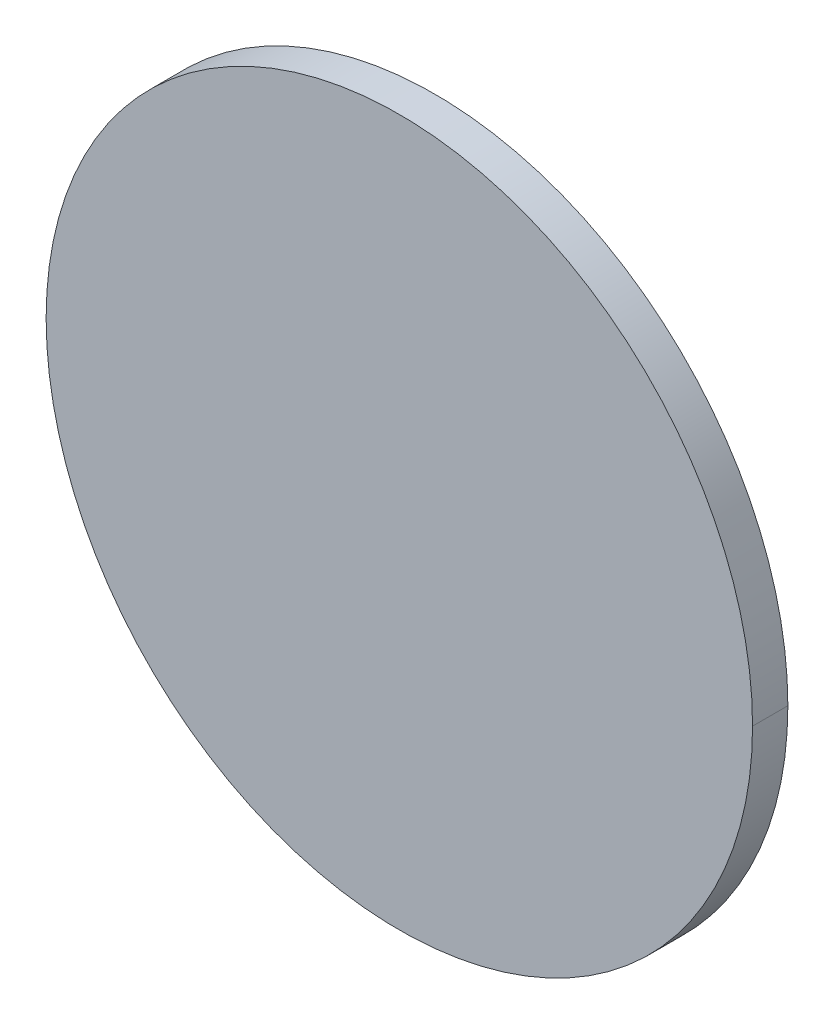
ISO-10303-21;
HEADER;
FILE_DESCRIPTION(('STEP AP214'),'2;1');
FILE_NAME('part.step','',(''),(''),'','','');
FILE_SCHEMA(('AUTOMOTIVE_DESIGN { 1 0 10303 214 1 1 1 1 }'));
ENDSEC;
DATA;
#1=APPLICATION_CONTEXT('core data for automotive mechanical design processes');
#2=APPLICATION_PROTOCOL_DEFINITION('international standard','automotive_design',2000,#1);
#3=PRODUCT_CONTEXT('',#1,'mechanical');
#4=PRODUCT('Part','Part','',(#3));
#5=PRODUCT_RELATED_PRODUCT_CATEGORY('part','',(#4));
#6=PRODUCT_DEFINITION_FORMATION('','',#4);
#7=PRODUCT_DEFINITION_CONTEXT('part definition',#1,'design');
#8=PRODUCT_DEFINITION('design','',#6,#7);
#9=PRODUCT_DEFINITION_SHAPE('','',#8);
#10=(LENGTH_UNIT() NAMED_UNIT(*) SI_UNIT(.MILLI.,.METRE.));
#11=(NAMED_UNIT(*) PLANE_ANGLE_UNIT() SI_UNIT($,.RADIAN.));
#12=(NAMED_UNIT(*) SI_UNIT($,.STERADIAN.) SOLID_ANGLE_UNIT());
#13=UNCERTAINTY_MEASURE_WITH_UNIT(LENGTH_MEASURE(1.E-05),#10,'distance_accuracy_value','');
#14=(GEOMETRIC_REPRESENTATION_CONTEXT(3) GLOBAL_UNCERTAINTY_ASSIGNED_CONTEXT((#13)) GLOBAL_UNIT_ASSIGNED_CONTEXT((#10,
#11,#12)) REPRESENTATION_CONTEXT('',''));
#15=CARTESIAN_POINT('',(0.,0.,0.));
#16=DIRECTION('',(0.,0.,1.));
#17=DIRECTION('',(1.,0.,0.));
#18=AXIS2_PLACEMENT_3D('',#15,#16,#17);
#19=CARTESIAN_POINT('',(0.,-0.4,-0.005));
#20=DIRECTION('',(0.,0.,1.));
#21=DIRECTION('',(1.,0.,0.));
#22=AXIS2_PLACEMENT_3D('',#19,#20,#21);
#23=CYLINDRICAL_SURFACE('',#22,0.1);
#24=CARTESIAN_POINT('',(0.,-0.4,-0.005));
#25=DIRECTION('',(0.,0.,1.));
#26=DIRECTION('',(1.,0.,0.));
#27=AXIS2_PLACEMENT_3D('',#24,#25,#26);
#28=CIRCLE('',#27,0.1);
#29=CARTESIAN_POINT('',(0.1,-0.4,-0.005));
#30=VERTEX_POINT('',#29);
#31=CARTESIAN_POINT('',(-0.1,-0.4,-0.005));
#32=VERTEX_POINT('',#31);
#33=EDGE_CURVE('E11',#30,#32,#28,.T.);
#34=ORIENTED_EDGE('',*,*,#33,.T.);
#35=DIRECTION('',(0.,0.,1.));
#36=VECTOR('',#35,1.);
#37=CARTESIAN_POINT('',(-0.1,-0.4,-0.005));
#38=LINE('',#37,#36);
#39=CARTESIAN_POINT('',(-0.1,-0.4,0.005));
#40=VERTEX_POINT('',#39);
#41=EDGE_CURVE('E24',#32,#40,#38,.T.);
#42=ORIENTED_EDGE('',*,*,#41,.T.);
#43=CARTESIAN_POINT('',(0.,-0.4,0.005));
#44=DIRECTION('',(0.,0.,1.));
#45=DIRECTION('',(1.,0.,0.));
#46=AXIS2_PLACEMENT_3D('',#43,#44,#45);
#47=CIRCLE('',#46,0.1);
#48=CARTESIAN_POINT('',(0.1,-0.4,0.005));
#49=VERTEX_POINT('',#48);
#50=EDGE_CURVE('E39',#49,#40,#47,.T.);
#51=ORIENTED_EDGE('',*,*,#50,.F.);
#52=DIRECTION('',(0.,0.,1.));
#53=VECTOR('',#52,1.);
#54=CARTESIAN_POINT('',(0.1,-0.4,-0.005));
#55=LINE('',#54,#53);
#56=EDGE_CURVE('E41',#30,#49,#55,.T.);
#57=ORIENTED_EDGE('',*,*,#56,.F.);
#58=EDGE_LOOP('',(#34,#42,#51,#57));
#59=FACE_BOUND('',#58,.T.);
#60=ADVANCED_FACE('F17',(#59),#23,.T.);
#61=CARTESIAN_POINT('',(0.,-0.4,-0.005));
#62=DIRECTION('',(0.,0.,1.));
#63=DIRECTION('',(1.,0.,0.));
#64=AXIS2_PLACEMENT_3D('',#61,#62,#63);
#65=CYLINDRICAL_SURFACE('',#64,0.1);
#66=ORIENTED_EDGE('',*,*,#41,.F.);
#67=CARTESIAN_POINT('',(0.,-0.4,-0.005));
#68=DIRECTION('',(0.,0.,1.));
#69=DIRECTION('',(1.,0.,0.));
#70=AXIS2_PLACEMENT_3D('',#67,#68,#69);
#71=CIRCLE('',#70,0.1);
#72=EDGE_CURVE('E50',#32,#30,#71,.T.);
#73=ORIENTED_EDGE('',*,*,#72,.T.);
#74=ORIENTED_EDGE('',*,*,#56,.T.);
#75=CARTESIAN_POINT('',(0.,-0.4,0.005));
#76=DIRECTION('',(0.,0.,1.));
#77=DIRECTION('',(1.,0.,0.));
#78=AXIS2_PLACEMENT_3D('',#75,#76,#77);
#79=CIRCLE('',#78,0.1);
#80=EDGE_CURVE('E49',#40,#49,#79,.T.);
#81=ORIENTED_EDGE('',*,*,#80,.F.);
#82=EDGE_LOOP('',(#66,#73,#74,#81));
#83=FACE_BOUND('',#82,.T.);
#84=ADVANCED_FACE('F48',(#83),#65,.T.);
#85=CARTESIAN_POINT('',(0.,0.,-0.005));
#86=DIRECTION('',(0.,0.,1.));
#87=DIRECTION('',(1.,0.,0.));
#88=AXIS2_PLACEMENT_3D('',#85,#86,#87);
#89=PLANE('',#88);
#90=ORIENTED_EDGE('',*,*,#33,.F.);
#91=ORIENTED_EDGE('',*,*,#72,.F.);
#92=EDGE_LOOP('',(#90,#91));
#93=FACE_BOUND('',#92,.T.);
#94=ADVANCED_FACE('F56',(#93),#89,.F.);
#95=CARTESIAN_POINT('',(0.,0.,0.005));
#96=DIRECTION('',(0.,0.,1.));
#97=DIRECTION('',(1.,0.,0.));
#98=AXIS2_PLACEMENT_3D('',#95,#96,#97);
#99=PLANE('',#98);
#100=ORIENTED_EDGE('',*,*,#50,.T.);
#101=ORIENTED_EDGE('',*,*,#80,.T.);
#102=EDGE_LOOP('',(#100,#101));
#103=FACE_BOUND('',#102,.T.);
#104=ADVANCED_FACE('F52',(#103),#99,.T.);
#105=CLOSED_SHELL('',(#60,#84,#94,#104));
#106=MANIFOLD_SOLID_BREP('B1',#105);
#107=ADVANCED_BREP_SHAPE_REPRESENTATION('',(#18,#106),#14);
#108=SHAPE_DEFINITION_REPRESENTATION(#9,#107);
ENDSEC;
END-ISO-10303-21;
